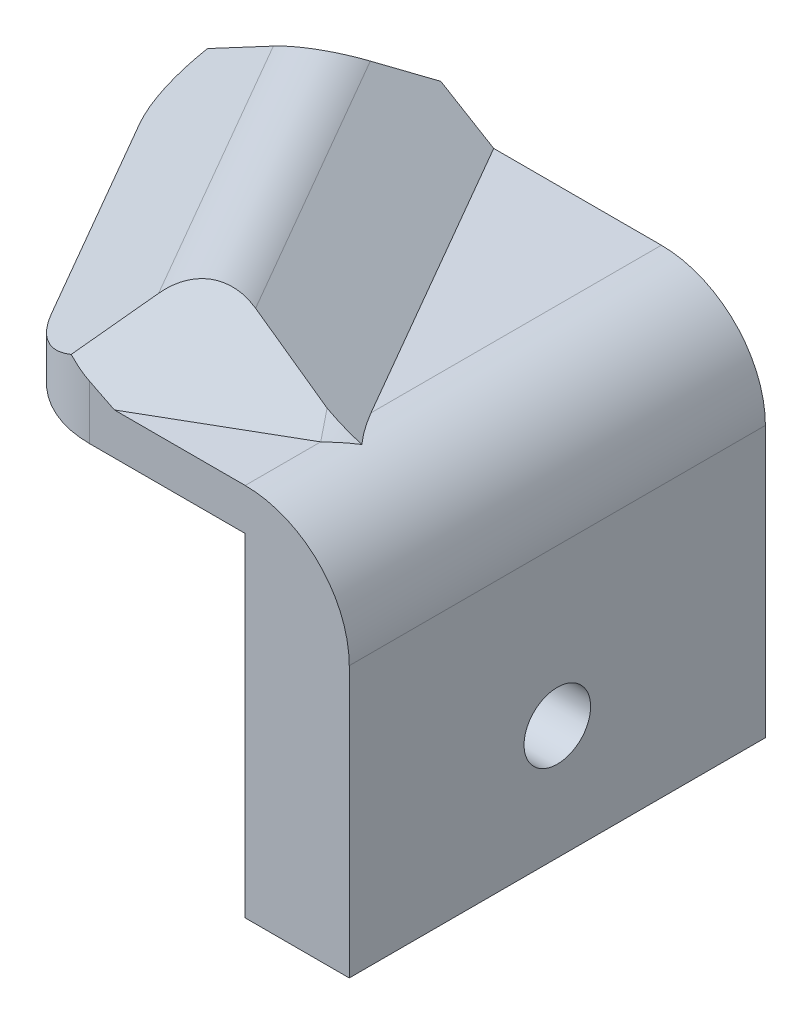
ISO-10303-21;
HEADER;
FILE_DESCRIPTION(('STEP AP214'),'2;1');
FILE_NAME('part.step','',(''),(''),'','','');
FILE_SCHEMA(('AUTOMOTIVE_DESIGN { 1 0 10303 214 1 1 1 1 }'));
ENDSEC;
DATA;
#1=APPLICATION_CONTEXT('core data for automotive mechanical design processes');
#2=APPLICATION_PROTOCOL_DEFINITION('international standard','automotive_design',2000,#1);
#3=PRODUCT_CONTEXT('',#1,'mechanical');
#4=PRODUCT('Part','Part','',(#3));
#5=PRODUCT_RELATED_PRODUCT_CATEGORY('part','',(#4));
#6=PRODUCT_DEFINITION_FORMATION('','',#4);
#7=PRODUCT_DEFINITION_CONTEXT('part definition',#1,'design');
#8=PRODUCT_DEFINITION('design','',#6,#7);
#9=PRODUCT_DEFINITION_SHAPE('','',#8);
#10=(LENGTH_UNIT() NAMED_UNIT(*) SI_UNIT(.MILLI.,.METRE.));
#11=(NAMED_UNIT(*) PLANE_ANGLE_UNIT() SI_UNIT($,.RADIAN.));
#12=(NAMED_UNIT(*) SI_UNIT($,.STERADIAN.) SOLID_ANGLE_UNIT());
#13=UNCERTAINTY_MEASURE_WITH_UNIT(LENGTH_MEASURE(1.E-05),#10,'distance_accuracy_value','');
#14=(GEOMETRIC_REPRESENTATION_CONTEXT(3) GLOBAL_UNCERTAINTY_ASSIGNED_CONTEXT((#13)) GLOBAL_UNIT_ASSIGNED_CONTEXT((#10,
#11,#12)) REPRESENTATION_CONTEXT('',''));
#15=CARTESIAN_POINT('',(0.,0.,0.));
#16=DIRECTION('',(0.,0.,1.));
#17=DIRECTION('',(1.,0.,0.));
#18=AXIS2_PLACEMENT_3D('',#15,#16,#17);
#19=CARTESIAN_POINT('',(0.,18.,0.));
#20=DIRECTION('',(0.,1.,0.));
#21=DIRECTION('',(0.,0.,1.));
#22=AXIS2_PLACEMENT_3D('',#19,#20,#21);
#23=PLANE('',#22);
#24=DIRECTION('',(-0.500000000000001,0.,-0.866025403784438));
#25=VECTOR('',#24,1.);
#26=CARTESIAN_POINT('',(54.6961524227068,18.,82.7365149746594));
#27=LINE('',#26,#25);
#28=CARTESIAN_POINT('',(55.4,18.,83.9556147393155));
#29=VERTEX_POINT('',#28);
#30=CARTESIAN_POINT('',(47.3427220735495,18.,70.));
#31=VERTEX_POINT('',#30);
#32=EDGE_CURVE('E443',#29,#31,#27,.T.);
#33=ORIENTED_EDGE('',*,*,#32,.F.);
#34=DIRECTION('',(0.,0.,-1.));
#35=VECTOR('',#34,1.);
#36=CARTESIAN_POINT('',(55.4,18.,70.));
#37=LINE('',#36,#35);
#38=CARTESIAN_POINT('',(55.4,18.,70.));
#39=VERTEX_POINT('',#38);
#40=EDGE_CURVE('E218',#29,#39,#37,.T.);
#41=ORIENTED_EDGE('',*,*,#40,.T.);
#42=DIRECTION('',(-1.,0.,0.));
#43=VECTOR('',#42,1.);
#44=CARTESIAN_POINT('',(33.4863156129984,18.,70.));
#45=LINE('',#44,#43);
#46=EDGE_CURVE('E197',#39,#31,#45,.T.);
#47=ORIENTED_EDGE('',*,*,#46,.T.);
#48=EDGE_LOOP('',(#33,#41,#47));
#49=FACE_BOUND('',#48,.T.);
#50=ADVANCED_FACE('F35',(#49),#23,.T.);
#51=CARTESIAN_POINT('',(42.1465696508428,18.,75.));
#52=DIRECTION('',(0.,1.,0.));
#53=DIRECTION('',(0.,0.,1.));
#54=AXIS2_PLACEMENT_3D('',#51,#52,#53);
#55=CIRCLE('',#54,5.);
#56=CARTESIAN_POINT('',(41.7257104231816,18.,70.0177437329567));
#57=VERTEX_POINT('',#56);
#58=CARTESIAN_POINT('',(38.0422387692497,18.,72.1443970839066));
#59=VERTEX_POINT('',#58);
#60=EDGE_CURVE('E213',#57,#59,#55,.T.);
#61=ORIENTED_EDGE('',*,*,#60,.T.);
#62=DIRECTION('',(0.866025403784438,0.,-0.500000000000001));
#63=VECTOR('',#62,1.);
#64=CARTESIAN_POINT('',(40.7500000000001,18.,70.5810704084317));
#65=LINE('',#64,#63);
#66=EDGE_CURVE('E232',#59,#57,#65,.T.);
#67=ORIENTED_EDGE('',*,*,#66,.T.);
#68=EDGE_LOOP('',(#61,#67));
#69=FACE_BOUND('',#68,.T.);
#70=ADVANCED_FACE('F322',(#69),#23,.T.);
#71=CARTESIAN_POINT('',(55.4,18.,90.));
#72=VERTEX_POINT('',#71);
#73=CARTESIAN_POINT('',(55.4,18.,86.371600270768));
#74=VERTEX_POINT('',#73);
#75=EDGE_CURVE('E227',#72,#74,#37,.T.);
#76=ORIENTED_EDGE('',*,*,#75,.T.);
#77=DIRECTION('',(-0.866025403784438,0.,0.500000000000001));
#78=VECTOR('',#77,1.);
#79=CARTESIAN_POINT('',(46.2341516219862,18.,91.6635052991656));
#80=LINE('',#79,#78);
#81=CARTESIAN_POINT('',(49.1154273188012,18.,90.));
#82=VERTEX_POINT('',#81);
#83=EDGE_CURVE('E465',#74,#82,#80,.T.);
#84=ORIENTED_EDGE('',*,*,#83,.T.);
#85=DIRECTION('',(1.,0.,0.));
#86=VECTOR('',#85,1.);
#87=CARTESIAN_POINT('',(60.4,18.,90.));
#88=LINE('',#87,#86);
#89=EDGE_CURVE('E195',#82,#72,#88,.T.);
#90=ORIENTED_EDGE('',*,*,#89,.T.);
#91=EDGE_LOOP('',(#76,#84,#90));
#92=FACE_BOUND('',#91,.T.);
#93=ADVANCED_FACE('F318',(#92),#23,.T.);
#94=CARTESIAN_POINT('',(60.4,18.,90.));
#95=DIRECTION('',(0.,0.,-1.));
#96=DIRECTION('',(-1.,0.,0.));
#97=AXIS2_PLACEMENT_3D('',#94,#95,#96);
#98=PLANE('',#97);
#99=DIRECTION('',(0.,-1.,0.));
#100=VECTOR('',#99,1.);
#101=CARTESIAN_POINT('',(60.4,18.,90.));
#102=LINE('',#101,#100);
#103=CARTESIAN_POINT('',(60.4,13.,90.));
#104=VERTEX_POINT('',#103);
#105=CARTESIAN_POINT('',(60.4,0.,90.));
#106=VERTEX_POINT('',#105);
#107=EDGE_CURVE('E208',#104,#106,#102,.T.);
#108=ORIENTED_EDGE('',*,*,#107,.F.);
#109=CARTESIAN_POINT('',(55.4,13.,90.));
#110=DIRECTION('',(0.,0.,-1.));
#111=DIRECTION('',(-1.,0.,0.));
#112=AXIS2_PLACEMENT_3D('',#109,#110,#111);
#113=CIRCLE('',#112,5.);
#114=EDGE_CURVE('E242',#104,#72,#113,.F.);
#115=ORIENTED_EDGE('',*,*,#114,.T.);
#116=ORIENTED_EDGE('',*,*,#89,.F.);
#117=DIRECTION('',(0.894427190999914,-0.447213595499962,0.));
#118=VECTOR('',#117,1.);
#119=CARTESIAN_POINT('',(58.1430854637602,13.4861709275204,90.));
#120=LINE('',#119,#118);
#121=CARTESIAN_POINT('',(47.9200723427391,18.597677488031,90.));
#122=VERTEX_POINT('',#121);
#123=EDGE_CURVE('E365',#82,#122,#120,.F.);
#124=ORIENTED_EDGE('',*,*,#123,.T.);
#125=DIRECTION('',(0.,-1.,0.));
#126=VECTOR('',#125,1.);
#127=CARTESIAN_POINT('',(47.9200723427391,18.,90.));
#128=LINE('',#127,#126);
#129=CARTESIAN_POINT('',(47.9200723427391,16.,89.9999999999999));
#130=VERTEX_POINT('',#129);
#131=EDGE_CURVE('E245',#122,#130,#128,.T.);
#132=ORIENTED_EDGE('',*,*,#131,.T.);
#133=DIRECTION('',(-1.,0.,0.));
#134=VECTOR('',#133,1.);
#135=CARTESIAN_POINT('',(33.4863156129984,16.,89.9999999999999));
#136=LINE('',#135,#134);
#137=CARTESIAN_POINT('',(55.3999999999999,16.,89.9999999999999));
#138=VERTEX_POINT('',#137);
#139=EDGE_CURVE('E185',#138,#130,#136,.T.);
#140=ORIENTED_EDGE('',*,*,#139,.F.);
#141=DIRECTION('',(0.,1.,0.));
#142=VECTOR('',#141,1.);
#143=CARTESIAN_POINT('',(55.3999999999999,0.,89.9999999999999));
#144=LINE('',#143,#142);
#145=CARTESIAN_POINT('',(55.3999999999999,0.,89.9999999999999));
#146=VERTEX_POINT('',#145);
#147=EDGE_CURVE('E166',#146,#138,#144,.T.);
#148=ORIENTED_EDGE('',*,*,#147,.F.);
#149=DIRECTION('',(1.,0.,0.));
#150=VECTOR('',#149,1.);
#151=CARTESIAN_POINT('',(60.4,0.,90.));
#152=LINE('',#151,#150);
#153=EDGE_CURVE('E170',#146,#106,#152,.T.);
#154=ORIENTED_EDGE('',*,*,#153,.T.);
#155=EDGE_LOOP('',(#108,#115,#116,#124,#132,#140,#148,#154));
#156=FACE_BOUND('',#155,.T.);
#157=ADVANCED_FACE('F321',(#156),#98,.F.);
#158=CARTESIAN_POINT('',(60.4,18.,70.));
#159=DIRECTION('',(-1.,0.,0.));
#160=DIRECTION('',(0.,0.,1.));
#161=AXIS2_PLACEMENT_3D('',#158,#159,#160);
#162=PLANE('',#161);
#163=CARTESIAN_POINT('',(60.4,5.5,80.));
#164=DIRECTION('',(1.,0.,0.));
#165=DIRECTION('',(0.,0.,-1.));
#166=AXIS2_PLACEMENT_3D('',#163,#164,#165);
#167=CIRCLE('',#166,1.60000000000001);
#168=CARTESIAN_POINT('',(60.4,5.5,78.4));
#169=VERTEX_POINT('',#168);
#170=EDGE_CURVE('E189',#169,#169,#167,.T.);
#171=ORIENTED_EDGE('',*,*,#170,.F.);
#172=EDGE_LOOP('',(#171));
#173=FACE_BOUND('',#172,.T.);
#174=DIRECTION('',(0.,-1.,0.));
#175=VECTOR('',#174,1.);
#176=CARTESIAN_POINT('',(60.4,18.,70.));
#177=LINE('',#176,#175);
#178=CARTESIAN_POINT('',(60.4,13.,70.));
#179=VERTEX_POINT('',#178);
#180=CARTESIAN_POINT('',(60.4,0.,70.));
#181=VERTEX_POINT('',#180);
#182=EDGE_CURVE('E200',#179,#181,#177,.T.);
#183=ORIENTED_EDGE('',*,*,#182,.F.);
#184=DIRECTION('',(0.,0.,-1.));
#185=VECTOR('',#184,1.);
#186=CARTESIAN_POINT('',(60.4,13.,90.));
#187=LINE('',#186,#185);
#188=EDGE_CURVE('E248',#179,#104,#187,.F.);
#189=ORIENTED_EDGE('',*,*,#188,.T.);
#190=ORIENTED_EDGE('',*,*,#107,.T.);
#191=DIRECTION('',(0.,0.,-1.));
#192=VECTOR('',#191,1.);
#193=CARTESIAN_POINT('',(60.4,0.,70.));
#194=LINE('',#193,#192);
#195=EDGE_CURVE('E203',#106,#181,#194,.T.);
#196=ORIENTED_EDGE('',*,*,#195,.T.);
#197=EDGE_LOOP('',(#183,#189,#190,#196));
#198=FACE_BOUND('',#197,.T.);
#199=ADVANCED_FACE('F333',(#173,#198),#162,.F.);
#200=CARTESIAN_POINT('',(33.4863156129984,18.,70.));
#201=DIRECTION('',(0.,0.,1.));
#202=DIRECTION('',(1.,0.,0.));
#203=AXIS2_PLACEMENT_3D('',#200,#201,#202);
#204=PLANE('',#203);
#205=ORIENTED_EDGE('',*,*,#46,.F.);
#206=CARTESIAN_POINT('',(55.4,13.,70.));
#207=DIRECTION('',(0.,0.,1.));
#208=DIRECTION('',(1.,0.,0.));
#209=AXIS2_PLACEMENT_3D('',#206,#207,#208);
#210=CIRCLE('',#209,5.);
#211=EDGE_CURVE('E249',#39,#179,#210,.F.);
#212=ORIENTED_EDGE('',*,*,#211,.T.);
#213=ORIENTED_EDGE('',*,*,#182,.T.);
#214=DIRECTION('',(-1.,0.,0.));
#215=VECTOR('',#214,1.);
#216=CARTESIAN_POINT('',(33.4863156129984,0.,70.));
#217=LINE('',#216,#215);
#218=CARTESIAN_POINT('',(55.3999999999999,0.,70.));
#219=VERTEX_POINT('',#218);
#220=EDGE_CURVE('E184',#181,#219,#217,.T.);
#221=ORIENTED_EDGE('',*,*,#220,.T.);
#222=DIRECTION('',(0.,1.,0.));
#223=VECTOR('',#222,1.);
#224=CARTESIAN_POINT('',(55.3999999999999,0.,70.));
#225=LINE('',#224,#223);
#226=CARTESIAN_POINT('',(55.3999999999999,16.,70.));
#227=VERTEX_POINT('',#226);
#228=EDGE_CURVE('E163',#219,#227,#225,.T.);
#229=ORIENTED_EDGE('',*,*,#228,.T.);
#230=DIRECTION('',(-1.,0.,0.));
#231=VECTOR('',#230,1.);
#232=CARTESIAN_POINT('',(33.4863156129984,16.,70.));
#233=LINE('',#232,#231);
#234=CARTESIAN_POINT('',(42.1465696508428,16.,70.));
#235=VERTEX_POINT('',#234);
#236=EDGE_CURVE('E174',#227,#235,#233,.T.);
#237=ORIENTED_EDGE('',*,*,#236,.T.);
#238=DIRECTION('',(0.,-1.,0.));
#239=VECTOR('',#238,1.);
#240=CARTESIAN_POINT('',(42.1465696508428,18.,70.));
#241=LINE('',#240,#239);
#242=CARTESIAN_POINT('',(42.1465696508428,18.1950630903322,70.));
#243=VERTEX_POINT('',#242);
#244=EDGE_CURVE('E221',#235,#243,#241,.F.);
#245=ORIENTED_EDGE('',*,*,#244,.T.);
#246=DIRECTION('',(0.894427190999917,0.447213595499956,0.));
#247=VECTOR('',#246,1.);
#248=CARTESIAN_POINT('',(35.1403411844344,14.691948857128,70.));
#249=LINE('',#248,#247);
#250=CARTESIAN_POINT('',(44.8001171434022,19.5218368366118,70.));
#251=VERTEX_POINT('',#250);
#252=EDGE_CURVE('E53',#243,#251,#249,.T.);
#253=ORIENTED_EDGE('',*,*,#252,.T.);
#254=DIRECTION('',(0.858047182766194,-0.513570863802647,0.));
#255=VECTOR('',#254,1.);
#256=CARTESIAN_POINT('',(37.1410125444429,24.1060753771562,70.));
#257=LINE('',#256,#255);
#258=EDGE_CURVE('E11',#31,#251,#257,.F.);
#259=ORIENTED_EDGE('',*,*,#258,.F.);
#260=EDGE_LOOP('',(#205,#212,#213,#221,#229,#237,#245,#253,#259));
#261=FACE_BOUND('',#260,.T.);
#262=ADVANCED_FACE('F182',(#261),#204,.F.);
#263=CARTESIAN_POINT('',(45.033320996791,18.,90.));
#264=DIRECTION('',(0.866025403784438,0.,-0.500000000000002));
#265=DIRECTION('',(-0.500000000000002,0.,-0.866025403784438));
#266=AXIS2_PLACEMENT_3D('',#263,#264,#265);
#267=PLANE('',#266);
#268=DIRECTION('',(0.500000000000002,0.,0.866025403784438));
#269=VECTOR('',#268,1.);
#270=CARTESIAN_POINT('',(45.033320996791,16.,90.));
#271=LINE('',#270,#269);
#272=CARTESIAN_POINT('',(37.8164426319206,16.,77.5));
#273=VERTEX_POINT('',#272);
#274=CARTESIAN_POINT('',(43.5899453238169,16.,87.5));
#275=VERTEX_POINT('',#274);
#276=EDGE_CURVE('E210',#273,#275,#271,.T.);
#277=ORIENTED_EDGE('',*,*,#276,.T.);
#278=DIRECTION('',(0.,-1.,0.));
#279=VECTOR('',#278,1.);
#280=CARTESIAN_POINT('',(43.5899453238169,18.,87.5));
#281=LINE('',#280,#279);
#282=CARTESIAN_POINT('',(43.5899453238169,18.,87.5));
#283=VERTEX_POINT('',#282);
#284=EDGE_CURVE('E234',#275,#283,#281,.F.);
#285=ORIENTED_EDGE('',*,*,#284,.T.);
#286=DIRECTION('',(-0.500000000000001,0.,-0.866025403784438));
#287=VECTOR('',#286,1.);
#288=CARTESIAN_POINT('',(44.3038475772935,18.,88.7365149746594));
#289=LINE('',#288,#287);
#290=CARTESIAN_POINT('',(37.8164426319207,18.,77.5));
#291=VERTEX_POINT('',#290);
#292=EDGE_CURVE('E445',#283,#291,#289,.T.);
#293=ORIENTED_EDGE('',*,*,#292,.T.);
#294=DIRECTION('',(0.,-1.,0.));
#295=VECTOR('',#294,1.);
#296=CARTESIAN_POINT('',(37.8164426319206,18.,77.5));
#297=LINE('',#296,#295);
#298=EDGE_CURVE('E236',#291,#273,#297,.T.);
#299=ORIENTED_EDGE('',*,*,#298,.T.);
#300=EDGE_LOOP('',(#277,#285,#293,#299));
#301=FACE_BOUND('',#300,.T.);
#302=ADVANCED_FACE('F326',(#301),#267,.F.);
#303=CARTESIAN_POINT('',(0.,0.,0.));
#304=DIRECTION('',(0.,1.,0.));
#305=DIRECTION('',(0.,0.,1.));
#306=AXIS2_PLACEMENT_3D('',#303,#304,#305);
#307=PLANE('',#306);
#308=ORIENTED_EDGE('',*,*,#153,.F.);
#309=DIRECTION('',(0.,0.,1.));
#310=VECTOR('',#309,1.);
#311=CARTESIAN_POINT('',(55.3999999999999,0.,70.));
#312=LINE('',#311,#310);
#313=EDGE_CURVE('E171',#219,#146,#312,.T.);
#314=ORIENTED_EDGE('',*,*,#313,.F.);
#315=ORIENTED_EDGE('',*,*,#220,.F.);
#316=ORIENTED_EDGE('',*,*,#195,.F.);
#317=EDGE_LOOP('',(#308,#314,#315,#316));
#318=FACE_BOUND('',#317,.T.);
#319=ADVANCED_FACE('F314',(#318),#307,.F.);
#320=CARTESIAN_POINT('',(33.4863156129984,16.,70.));
#321=DIRECTION('',(0.,1.,0.));
#322=DIRECTION('',(0.,0.,1.));
#323=AXIS2_PLACEMENT_3D('',#320,#321,#322);
#324=PLANE('',#323);
#325=ORIENTED_EDGE('',*,*,#139,.T.);
#326=CARTESIAN_POINT('',(47.9200723427391,16.,85.));
#327=DIRECTION('',(0.,1.,0.));
#328=DIRECTION('',(0.,0.,1.));
#329=AXIS2_PLACEMENT_3D('',#326,#327,#328);
#330=CIRCLE('',#329,5.);
#331=EDGE_CURVE('E239',#130,#275,#330,.F.);
#332=ORIENTED_EDGE('',*,*,#331,.T.);
#333=ORIENTED_EDGE('',*,*,#276,.F.);
#334=CARTESIAN_POINT('',(42.1465696508428,16.,75.));
#335=DIRECTION('',(0.,1.,0.));
#336=DIRECTION('',(0.,0.,1.));
#337=AXIS2_PLACEMENT_3D('',#334,#335,#336);
#338=CIRCLE('',#337,5.);
#339=EDGE_CURVE('E177',#273,#235,#338,.F.);
#340=ORIENTED_EDGE('',*,*,#339,.T.);
#341=ORIENTED_EDGE('',*,*,#236,.F.);
#342=DIRECTION('',(0.,0.,1.));
#343=VECTOR('',#342,1.);
#344=CARTESIAN_POINT('',(55.3999999999999,16.,70.));
#345=LINE('',#344,#343);
#346=EDGE_CURVE('E159',#227,#138,#345,.T.);
#347=ORIENTED_EDGE('',*,*,#346,.T.);
#348=EDGE_LOOP('',(#325,#332,#333,#340,#341,#347));
#349=FACE_BOUND('',#348,.T.);
#350=ADVANCED_FACE('F175',(#349),#324,.F.);
#351=CARTESIAN_POINT('',(55.3999999999999,0.,70.));
#352=DIRECTION('',(1.,0.,0.));
#353=DIRECTION('',(0.,0.,-1.));
#354=AXIS2_PLACEMENT_3D('',#351,#352,#353);
#355=PLANE('',#354);
#356=CARTESIAN_POINT('',(55.3999999999999,5.5,80.));
#357=DIRECTION('',(1.,0.,0.));
#358=DIRECTION('',(0.,0.,-1.));
#359=AXIS2_PLACEMENT_3D('',#356,#357,#358);
#360=CIRCLE('',#359,1.60000000000001);
#361=CARTESIAN_POINT('',(55.3999999999999,5.5,78.4));
#362=VERTEX_POINT('',#361);
#363=EDGE_CURVE('E192',#362,#362,#360,.T.);
#364=ORIENTED_EDGE('',*,*,#363,.T.);
#365=EDGE_LOOP('',(#364));
#366=FACE_BOUND('',#365,.T.);
#367=ORIENTED_EDGE('',*,*,#147,.T.);
#368=ORIENTED_EDGE('',*,*,#346,.F.);
#369=ORIENTED_EDGE('',*,*,#228,.F.);
#370=ORIENTED_EDGE('',*,*,#313,.T.);
#371=EDGE_LOOP('',(#367,#368,#369,#370));
#372=FACE_BOUND('',#371,.T.);
#373=ADVANCED_FACE('F161',(#366,#372),#355,.F.);
#374=CARTESIAN_POINT('',(33.4863156129984,5.5,80.));
#375=DIRECTION('',(1.,0.,0.));
#376=DIRECTION('',(0.,0.,-1.));
#377=AXIS2_PLACEMENT_3D('',#374,#375,#376);
#378=CYLINDRICAL_SURFACE('',#377,1.60000000000001);
#379=CARTESIAN_POINT('',(60.4,5.5,78.4));
#380=CARTESIAN_POINT('',(60.3479166666667,5.5,78.4));
#381=CARTESIAN_POINT('',(60.2958333333333,5.5,78.4));
#382=CARTESIAN_POINT('',(60.1916666666666,5.5,78.4));
#383=CARTESIAN_POINT('',(60.1395833333333,5.5,78.4));
#384=CARTESIAN_POINT('',(60.0354166666667,5.5,78.4));
#385=CARTESIAN_POINT('',(59.9833333333333,5.5,78.4));
#386=CARTESIAN_POINT('',(59.8791666666666,5.5,78.4));
#387=CARTESIAN_POINT('',(59.8270833333333,5.5,78.4));
#388=CARTESIAN_POINT('',(59.7229166666666,5.5,78.4));
#389=CARTESIAN_POINT('',(59.6708333333333,5.5,78.4));
#390=CARTESIAN_POINT('',(59.5666666666666,5.5,78.4));
#391=CARTESIAN_POINT('',(59.5145833333333,5.5,78.4));
#392=CARTESIAN_POINT('',(59.4104166666666,5.5,78.4));
#393=CARTESIAN_POINT('',(59.3583333333333,5.5,78.4));
#394=CARTESIAN_POINT('',(59.2541666666666,5.5,78.4));
#395=CARTESIAN_POINT('',(59.2020833333333,5.5,78.4));
#396=CARTESIAN_POINT('',(59.0979166666666,5.5,78.4));
#397=CARTESIAN_POINT('',(59.0458333333333,5.5,78.4));
#398=CARTESIAN_POINT('',(58.9416666666666,5.5,78.4));
#399=CARTESIAN_POINT('',(58.8895833333333,5.5,78.4));
#400=CARTESIAN_POINT('',(58.7854166666666,5.5,78.4));
#401=CARTESIAN_POINT('',(58.7333333333333,5.5,78.4));
#402=CARTESIAN_POINT('',(58.6291666666666,5.5,78.4));
#403=CARTESIAN_POINT('',(58.5770833333333,5.5,78.4));
#404=CARTESIAN_POINT('',(58.4729166666666,5.5,78.4));
#405=CARTESIAN_POINT('',(58.4208333333333,5.5,78.4));
#406=CARTESIAN_POINT('',(58.3166666666666,5.5,78.4));
#407=CARTESIAN_POINT('',(58.2645833333333,5.5,78.4));
#408=CARTESIAN_POINT('',(58.1604166666666,5.5,78.4));
#409=CARTESIAN_POINT('',(58.1083333333333,5.5,78.4));
#410=CARTESIAN_POINT('',(58.0041666666666,5.5,78.4));
#411=CARTESIAN_POINT('',(57.9520833333333,5.5,78.4));
#412=CARTESIAN_POINT('',(57.8479166666666,5.5,78.4));
#413=CARTESIAN_POINT('',(57.7958333333333,5.5,78.4));
#414=CARTESIAN_POINT('',(57.6916666666666,5.5,78.4));
#415=CARTESIAN_POINT('',(57.6395833333333,5.5,78.4));
#416=CARTESIAN_POINT('',(57.5354166666666,5.5,78.4));
#417=CARTESIAN_POINT('',(57.4833333333333,5.5,78.4));
#418=CARTESIAN_POINT('',(57.3791666666666,5.5,78.4));
#419=CARTESIAN_POINT('',(57.3270833333333,5.5,78.4));
#420=CARTESIAN_POINT('',(57.2229166666666,5.5,78.4));
#421=CARTESIAN_POINT('',(57.1708333333333,5.5,78.4));
#422=CARTESIAN_POINT('',(57.0666666666666,5.5,78.4));
#423=CARTESIAN_POINT('',(57.0145833333333,5.5,78.4));
#424=CARTESIAN_POINT('',(56.9104166666666,5.5,78.4));
#425=CARTESIAN_POINT('',(56.8583333333333,5.5,78.4));
#426=CARTESIAN_POINT('',(56.7541666666666,5.5,78.4));
#427=CARTESIAN_POINT('',(56.7020833333333,5.5,78.4));
#428=CARTESIAN_POINT('',(56.5979166666666,5.5,78.4));
#429=CARTESIAN_POINT('',(56.5458333333333,5.5,78.4));
#430=CARTESIAN_POINT('',(56.4416666666666,5.5,78.4));
#431=CARTESIAN_POINT('',(56.3895833333333,5.5,78.4));
#432=CARTESIAN_POINT('',(56.2854166666666,5.5,78.4));
#433=CARTESIAN_POINT('',(56.2333333333333,5.5,78.4));
#434=CARTESIAN_POINT('',(56.1291666666666,5.5,78.4));
#435=CARTESIAN_POINT('',(56.0770833333333,5.5,78.4));
#436=CARTESIAN_POINT('',(55.9729166666666,5.5,78.4));
#437=CARTESIAN_POINT('',(55.9208333333333,5.5,78.4));
#438=CARTESIAN_POINT('',(55.8166666666666,5.5,78.4));
#439=CARTESIAN_POINT('',(55.7645833333333,5.5,78.4));
#440=CARTESIAN_POINT('',(55.6604166666666,5.5,78.4));
#441=CARTESIAN_POINT('',(55.6083333333333,5.5,78.4));
#442=CARTESIAN_POINT('',(55.5041666666666,5.5,78.4));
#443=CARTESIAN_POINT('',(55.4520833333333,5.5,78.4));
#444=CARTESIAN_POINT('',(55.3999999999999,5.5,78.4));
#445=B_SPLINE_CURVE_WITH_KNOTS('',3,(#379,#380,#381,#382,#383,#384,#385,#386,#387,#388,#389,
#390,#391,#392,#393,#394,#395,#396,#397,#398,#399,#400,#401,#402,#403,#404,#405,#406,#407,#408,
#409,#410,#411,#412,#413,#414,#415,#416,#417,#418,#419,#420,#421,#422,#423,#424,#425,#426,#427,
#428,#429,#430,#431,#432,#433,#434,#435,#436,#437,#438,#439,#440,#441,#442,#443,#444),
.UNSPECIFIED.,.F.,.F.,(4,2,2,2,2,2,2,2,2,2,2,2,2,2,2,2,2,2,2,2,2,2,2,2,2,2,2,2,2,2,2,2,4),(0.,
0.156250000000011,0.312500000000007,0.468750000000011,0.625000000000014,0.781250000000011,
0.937500000000015,1.09375000000002,1.25000000000002,1.40625000000003,1.56250000000002,
1.71875000000003,1.87500000000003,2.03125000000003,2.18750000000004,2.34375000000003,
2.50000000000004,2.65625000000004,2.81250000000004,2.96875000000005,3.12500000000004,
3.28125000000005,3.43750000000005,3.59375000000005,3.75000000000006,3.90625000000006,
4.06250000000005,4.21875000000006,4.37500000000006,4.53125000000006,4.68750000000007,
4.84375000000006,5.00000000000007),.UNSPECIFIED.);
#446=EDGE_CURVE('BSEAM307',#169,#362,#445,.T.);
#447=ORIENTED_EDGE('',*,*,#170,.T.);
#448=ORIENTED_EDGE('',*,*,#363,.F.);
#449=ORIENTED_EDGE('',*,*,#446,.T.);
#450=ORIENTED_EDGE('',*,*,#446,.F.);
#451=EDGE_LOOP('',(#447,#449,#448,#450));
#452=FACE_BOUND('',#451,.T.);
#453=ADVANCED_FACE('F307',(#452),#378,.F.);
#454=CARTESIAN_POINT('',(49.5000000000001,18.5,85.7365149746594));
#455=DIRECTION('',(-0.500000000000001,0.,-0.866025403784438));
#456=DIRECTION('',(-0.866025403784438,0.,0.500000000000001));
#457=AXIS2_PLACEMENT_3D('',#454,#455,#456);
#458=CYLINDRICAL_SURFACE('',#457,3.);
#459=CARTESIAN_POINT('',(41.0000000000001,18.5,71.0140831103239));
#460=DIRECTION('',(0.353553390593273,-0.707106781186551,0.612372435695791));
#461=DIRECTION('',(-0.353553390593276,-0.707106781186544,-0.612372435695797));
#462=AXIS2_PLACEMENT_3D('',#459,#460,#461);
#463=ELLIPSE('',#462,4.24264068711931,3.);
#464=CARTESIAN_POINT('',(43.7111152852268,20.9679381677295,72.2985495015581));
#465=VERTEX_POINT('',#464);
#466=CARTESIAN_POINT('',(42.5000000000001,21.5,73.6121593216772));
#467=VERTEX_POINT('',#466);
#468=EDGE_CURVE('E267',#465,#467,#463,.T.);
#469=ORIENTED_EDGE('',*,*,#468,.T.);
#470=CARTESIAN_POINT('',(41.0000000000001,18.5,71.0140831103239));
#471=DIRECTION('',(0.353553390593273,-0.707106781186551,0.612372435695791));
#472=DIRECTION('',(-0.353553390593276,-0.707106781186544,-0.612372435695797));
#473=AXIS2_PLACEMENT_3D('',#470,#471,#472);
#474=ELLIPSE('',#473,4.24264068711931,3.);
#475=CARTESIAN_POINT('',(40.756822882503,20.9679381677295,74.0042110155356));
#476=VERTEX_POINT('',#475);
#477=EDGE_CURVE('E272',#467,#476,#474,.T.);
#478=ORIENTED_EDGE('',*,*,#477,.T.);
#479=DIRECTION('',(-0.500000000000001,0.,-0.866025403784438));
#480=VECTOR('',#479,1.);
#481=CARTESIAN_POINT('',(48.0228537986382,20.9679381677295,86.5893457316481));
#482=LINE('',#481,#480);
#483=CARTESIAN_POINT('',(48.2888847147735,20.9679381677295,87.0501247947785));
#484=VERTEX_POINT('',#483);
#485=EDGE_CURVE('E376',#484,#476,#482,.T.);
#486=ORIENTED_EDGE('',*,*,#485,.F.);
#487=CARTESIAN_POINT('',(51.0000000000002,18.5,88.3345911860127));
#488=DIRECTION('',(0.353553390593276,0.707106781186545,0.612372435695797));
#489=DIRECTION('',(-0.353553390593273,0.707106781186551,-0.612372435695791));
#490=AXIS2_PLACEMENT_3D('',#487,#488,#489);
#491=ELLIPSE('',#490,4.24264068711927,3.);
#492=CARTESIAN_POINT('',(49.5000000000002,21.5,85.7365149746594));
#493=VERTEX_POINT('',#492);
#494=EDGE_CURVE('E259',#484,#493,#491,.F.);
#495=ORIENTED_EDGE('',*,*,#494,.T.);
#496=CARTESIAN_POINT('',(51.0000000000002,18.5,88.3345911860127));
#497=DIRECTION('',(0.353553390593276,0.707106781186545,0.612372435695797));
#498=DIRECTION('',(-0.353553390593273,0.707106781186551,-0.612372435695791));
#499=AXIS2_PLACEMENT_3D('',#496,#497,#498);
#500=ELLIPSE('',#499,4.24264068711927,3.);
#501=CARTESIAN_POINT('',(51.2431771174973,20.9679381677295,85.344463280801));
#502=VERTEX_POINT('',#501);
#503=EDGE_CURVE('E359',#493,#502,#500,.F.);
#504=ORIENTED_EDGE('',*,*,#503,.T.);
#505=DIRECTION('',(-0.500000000000001,0.,-0.866025403784438));
#506=VECTOR('',#505,1.);
#507=CARTESIAN_POINT('',(50.977146201362,20.9679381677295,84.8836842176706));
#508=LINE('',#507,#506);
#509=EDGE_CURVE('E385',#502,#465,#508,.T.);
#510=ORIENTED_EDGE('',*,*,#509,.T.);
#511=EDGE_LOOP('',(#469,#478,#486,#495,#504,#510));
#512=FACE_BOUND('',#511,.T.);
#513=ADVANCED_FACE('F303',(#512),#458,.T.);
#514=CARTESIAN_POINT('',(44.3038475772935,18.,88.7365149746594));
#515=DIRECTION('',(0.492382067120635,-0.822646055909838,-0.284276918996244));
#516=DIRECTION('',(0.858047182766194,0.513570863802647,0.));
#517=AXIS2_PLACEMENT_3D('',#514,#515,#516);
#518=PLANE('',#517);
#519=ORIENTED_EDGE('',*,*,#292,.F.);
#520=CARTESIAN_POINT('',(47.9200723427391,21.4556406969196,85.));
#521=DIRECTION('',(0.492382067120635,-0.822646055909838,-0.284276918996244));
#522=DIRECTION('',(-0.712432382740993,-0.568553837992487,0.41132302795492));
#523=AXIS2_PLACEMENT_3D('',#520,#521,#522);
#524=ELLIPSE('',#523,6.07794806050586,5.);
#525=CARTESIAN_POINT('',(46.9374911507002,19.1734030921471,89.9025028506928));
#526=VERTEX_POINT('',#525);
#527=EDGE_CURVE('E230',#283,#526,#524,.F.);
#528=ORIENTED_EDGE('',*,*,#527,.T.);
#529=DIRECTION('',(-0.372203086546608,-0.494253866382706,0.785606757819028));
#530=VECTOR('',#529,1.);
#531=CARTESIAN_POINT('',(46.6977174284119,18.8550040955199,90.4085917666254));
#532=LINE('',#531,#530);
#533=EDGE_CURVE('E371',#526,#484,#532,.F.);
#534=ORIENTED_EDGE('',*,*,#533,.T.);
#535=ORIENTED_EDGE('',*,*,#485,.T.);
#536=DIRECTION('',(-0.866456952929312,-0.494253866382704,-0.0704660505931775));
#537=VECTOR('',#536,1.);
#538=CARTESIAN_POINT('',(43.0482173104846,22.2750204775995,74.1905624726336));
#539=LINE('',#538,#537);
#540=CARTESIAN_POINT('',(37.312111290046,19.0029680472992,73.7240641247612));
#541=VERTEX_POINT('',#540);
#542=EDGE_CURVE('E275',#476,#541,#539,.T.);
#543=ORIENTED_EDGE('',*,*,#542,.T.);
#544=CARTESIAN_POINT('',(42.1465696508428,21.4556406969196,75.));
#545=DIRECTION('',(0.492382067120635,-0.822646055909838,-0.284276918996244));
#546=DIRECTION('',(-0.712432382740993,-0.568553837992487,0.41132302795492));
#547=AXIS2_PLACEMENT_3D('',#544,#545,#546);
#548=ELLIPSE('',#547,6.07794806050586,5.);
#549=EDGE_CURVE('E60',#541,#291,#548,.F.);
#550=ORIENTED_EDGE('',*,*,#549,.T.);
#551=EDGE_LOOP('',(#519,#528,#534,#535,#543,#550));
#552=FACE_BOUND('',#551,.T.);
#553=ADVANCED_FACE('F300',(#552),#518,.F.);
#554=CARTESIAN_POINT('',(54.6961524227068,18.,82.7365149746594));
#555=DIRECTION('',(-0.492382067120635,-0.822646055909838,0.284276918996244));
#556=DIRECTION('',(0.858047182766194,-0.513570863802647,0.));
#557=AXIS2_PLACEMENT_3D('',#554,#555,#556);
#558=PLANE('',#557);
#559=ORIENTED_EDGE('',*,*,#32,.T.);
#560=ORIENTED_EDGE('',*,*,#258,.T.);
#561=DIRECTION('',(-0.372203086546602,0.494253866382704,0.785606757819032));
#562=VECTOR('',#561,1.);
#563=CARTESIAN_POINT('',(42.7268031671151,22.2750204775995,74.3761310148294));
#564=LINE('',#563,#562);
#565=EDGE_CURVE('E265',#251,#465,#564,.T.);
#566=ORIENTED_EDGE('',*,*,#565,.T.);
#567=ORIENTED_EDGE('',*,*,#509,.F.);
#568=DIRECTION('',(-0.866456952929311,0.494253866382706,-0.0704660505931704));
#569=VECTOR('',#568,1.);
#570=CARTESIAN_POINT('',(54.9472784760686,18.8550040955199,85.6457054750645));
#571=LINE('',#570,#569);
#572=CARTESIAN_POINT('',(54.9825611037172,18.8348777925656,85.6485748933507));
#573=VERTEX_POINT('',#572);
#574=EDGE_CURVE('E288',#502,#573,#571,.F.);
#575=ORIENTED_EDGE('',*,*,#574,.T.);
#576=CARTESIAN_POINT('',(56.3975384555021,17.8994845151619,85.3925208078891));
#577=CARTESIAN_POINT('',(56.3441996321149,17.9375998825257,85.4104356997604));
#578=CARTESIAN_POINT('',(56.2904667798865,17.9756150767401,85.4273860595936));
#579=CARTESIAN_POINT('',(56.181563264194,18.0519169207002,85.4595874588749));
#580=CARTESIAN_POINT('',(56.1263829844628,18.090200545274,85.4748131590101));
#581=CARTESIAN_POINT('',(56.0145572182328,18.1670455590252,85.503525472951));
#582=CARTESIAN_POINT('',(55.9579020494644,18.2056031961977,85.516984384056));
#583=CARTESIAN_POINT('',(55.8431015164043,18.2830007415036,85.5421298712298));
#584=CARTESIAN_POINT('',(55.7849465688688,18.3218361173533,85.5537866087455));
#585=CARTESIAN_POINT('',(55.6671238441369,18.3997917664272,85.5752966047017));
#586=CARTESIAN_POINT('',(55.6074467378407,18.4389066879053,85.5851180955874));
#587=CARTESIAN_POINT('',(55.4865594538079,18.5174227324839,85.6029296047665));
#588=CARTESIAN_POINT('',(55.4253403424003,18.5568176706312,85.6108861805434));
#589=CARTESIAN_POINT('',(55.3013517415334,18.6358936021937,85.624942245126));
#590=CARTESIAN_POINT('',(55.2385738463667,18.6755675783921,85.6310068794417));
#591=CARTESIAN_POINT('',(55.1114515780304,18.7552019307092,85.6412568713395));
#592=CARTESIAN_POINT('',(55.0470994086256,18.7951545088004,85.645406255895));
#593=CARTESIAN_POINT('',(54.9825611037172,18.8348777925656,85.6485748933507));
#594=B_SPLINE_CURVE_WITH_KNOTS('',3,(#576,#577,#578,#579,#580,#581,#582,#583,#584,#585,#586,
#587,#588,#589,#590,#591,#592,#593),.UNSPECIFIED.,.F.,.F.,(4,2,2,2,2,2,2,2,4),(0.,
0.20387453340917,0.410435922511565,0.619924543049408,0.832577165544466,1.0486251710752,
1.2682929615349,1.49179658135069,1.71934255845798),.UNSPECIFIED.);
#595=CARTESIAN_POINT('',(56.397538971202,17.8994811971201,85.3925196852249));
#596=VERTEX_POINT('',#595);
#597=EDGE_CURVE('E282',#573,#596,#594,.F.);
#598=ORIENTED_EDGE('',*,*,#597,.T.);
#599=CARTESIAN_POINT('',(55.4,13.,69.4865178668974));
#600=DIRECTION('',(-0.492382067120635,-0.822646055909838,0.284276918996244));
#601=DIRECTION('',(0.145996342848057,0.243923009470181,0.958742214219236));
#602=AXIS2_PLACEMENT_3D('',#599,#600,#601);
#603=ELLIPSE('',#602,17.5884838545969,5.);
#604=EDGE_CURVE('E352',#29,#596,#603,.F.);
#605=ORIENTED_EDGE('',*,*,#604,.F.);
#606=EDGE_LOOP('',(#559,#560,#566,#567,#575,#598,#605));
#607=FACE_BOUND('',#606,.T.);
#608=ADVANCED_FACE('F290',(#607),#558,.F.);
#609=CARTESIAN_POINT('',(55.4,13.,0.));
#610=DIRECTION('',(0.,0.,1.));
#611=DIRECTION('',(1.,0.,0.));
#612=AXIS2_PLACEMENT_3D('',#609,#610,#611);
#613=CYLINDRICAL_SURFACE('',#612,5.);
#614=ORIENTED_EDGE('',*,*,#40,.F.);
#615=ORIENTED_EDGE('',*,*,#604,.T.);
#616=CARTESIAN_POINT('',(55.4,18.,86.371600270768));
#617=CARTESIAN_POINT('',(55.7515000063927,18.0000293273654,86.0266046111394));
#618=CARTESIAN_POINT('',(56.1029868026514,17.9628273276738,85.6816219171971));
#619=CARTESIAN_POINT('',(56.4466925657019,17.889216161401,85.3442762720045));
#620=B_SPLINE_CURVE_WITH_KNOTS('',3,(#616,#617,#618,#619),.UNSPECIFIED.,.F.,.F.,(4,4),
(4.50149054503646,4.71238898038469),.UNSPECIFIED.);
#621=EDGE_CURVE('E360',#596,#74,#620,.F.);
#622=ORIENTED_EDGE('',*,*,#621,.T.);
#623=ORIENTED_EDGE('',*,*,#75,.F.);
#624=ORIENTED_EDGE('',*,*,#114,.F.);
#625=ORIENTED_EDGE('',*,*,#188,.F.);
#626=ORIENTED_EDGE('',*,*,#211,.F.);
#627=EDGE_LOOP('',(#614,#615,#622,#623,#624,#625,#626));
#628=FACE_BOUND('',#627,.T.);
#629=ADVANCED_FACE('F299',(#628),#613,.T.);
#630=CARTESIAN_POINT('',(47.9200723427391,18.,85.));
#631=DIRECTION('',(0.,-1.,0.));
#632=DIRECTION('',(0.,0.,-1.));
#633=AXIS2_PLACEMENT_3D('',#630,#631,#632);
#634=CYLINDRICAL_SURFACE('',#633,5.);
#635=ORIENTED_EDGE('',*,*,#527,.F.);
#636=ORIENTED_EDGE('',*,*,#284,.F.);
#637=ORIENTED_EDGE('',*,*,#331,.F.);
#638=ORIENTED_EDGE('',*,*,#131,.F.);
#639=CARTESIAN_POINT('',(47.9200723427391,22.9278045069533,85.));
#640=DIRECTION('',(0.353553390593276,0.707106781186545,0.612372435695797));
#641=DIRECTION('',(0.353553390593273,-0.707106781186551,0.612372435695791));
#642=AXIS2_PLACEMENT_3D('',#639,#640,#641);
#643=ELLIPSE('',#642,7.0710678118655,5.);
#644=EDGE_CURVE('E368',#122,#526,#643,.F.);
#645=ORIENTED_EDGE('',*,*,#644,.T.);
#646=EDGE_LOOP('',(#635,#636,#637,#638,#645));
#647=FACE_BOUND('',#646,.T.);
#648=ADVANCED_FACE('F343',(#647),#634,.T.);
#649=CARTESIAN_POINT('',(42.1465696508428,18.,75.));
#650=DIRECTION('',(0.,-1.,0.));
#651=DIRECTION('',(0.,0.,-1.));
#652=AXIS2_PLACEMENT_3D('',#649,#650,#651);
#653=CYLINDRICAL_SURFACE('',#652,5.);
#654=ORIENTED_EDGE('',*,*,#60,.F.);
#655=CARTESIAN_POINT('',(42.1465696508428,22.5251901092543,75.));
#656=DIRECTION('',(0.353553390593273,-0.707106781186551,0.612372435695791));
#657=DIRECTION('',(-0.353553390593276,-0.707106781186544,-0.612372435695797));
#658=AXIS2_PLACEMENT_3D('',#655,#656,#657);
#659=ELLIPSE('',#658,7.07106781186544,5.);
#660=EDGE_CURVE('E254',#57,#243,#659,.T.);
#661=ORIENTED_EDGE('',*,*,#660,.T.);
#662=ORIENTED_EDGE('',*,*,#244,.F.);
#663=ORIENTED_EDGE('',*,*,#339,.F.);
#664=ORIENTED_EDGE('',*,*,#298,.F.);
#665=ORIENTED_EDGE('',*,*,#549,.F.);
#666=CARTESIAN_POINT('',(42.1465696508428,22.5251901092543,75.));
#667=DIRECTION('',(0.353553390593273,-0.707106781186551,0.612372435695791));
#668=DIRECTION('',(-0.353553390593276,-0.707106781186544,-0.612372435695797));
#669=AXIS2_PLACEMENT_3D('',#666,#667,#668);
#670=ELLIPSE('',#669,7.07106781186544,5.);
#671=EDGE_CURVE('E45',#541,#59,#670,.T.);
#672=ORIENTED_EDGE('',*,*,#671,.T.);
#673=EDGE_LOOP('',(#654,#661,#662,#663,#664,#665,#672));
#674=FACE_BOUND('',#673,.T.);
#675=ADVANCED_FACE('F255',(#674),#653,.T.);
#676=CARTESIAN_POINT('',(53.65,21.5000000000001,83.3405113575225));
#677=CARTESIAN_POINT('',(54.2475500108675,21.5000498565213,82.9955156978938));
#678=CARTESIAN_POINT('',(54.8450775645074,21.4368064570456,82.6505330039516));
#679=CARTESIAN_POINT('',(55.4293773616932,21.3116674743817,82.313187358759));
#680=CARTESIAN_POINT('',(55.4,18.,86.371600270768));
#681=CARTESIAN_POINT('',(55.7515000063927,18.0000293273654,86.0266046111394));
#682=CARTESIAN_POINT('',(56.1029868026514,17.9628273276738,85.6816219171971));
#683=CARTESIAN_POINT('',(56.4466925657019,17.889216161401,85.3442762720045));
#684=B_SPLINE_SURFACE_WITH_KNOTS('',1,3,((#676,#677,#678,#679),(#680,#681,#682,#683)),
.UNSPECIFIED.,.F.,.F.,.F.,(2,2),(4,4),(0.,1.),(4.50149054503646,4.71238898038469),.UNSPECIFIED.);
#685=CARTESIAN_POINT('',(53.65,21.5000000000001,83.3405113575225));
#686=CARTESIAN_POINT('',(55.4,18.,86.371600270768));
#687=B_SPLINE_CURVE_WITH_KNOTS('',1,(#685,#686),.UNSPECIFIED.,.F.,.F.,(2,2),(0.,1.),.UNSPECIFIED.);
#688=EDGE_CURVE('E383',#74,#573,#687,.F.);
#689=ORIENTED_EDGE('',*,*,#621,.F.);
#690=ORIENTED_EDGE('',*,*,#597,.F.);
#691=ORIENTED_EDGE('',*,*,#688,.F.);
#692=EDGE_LOOP('',(#689,#690,#691));
#693=FACE_BOUND('',#692,.T.);
#694=ADVANCED_FACE('F388',(#693),#684,.T.);
#695=CARTESIAN_POINT('',(49.5000000000001,21.5000000000001,85.7365149746594));
#696=DIRECTION('',(0.353553390593276,0.707106781186545,0.612372435695797));
#697=DIRECTION('',(-0.866025403784438,0.,0.500000000000001));
#698=AXIS2_PLACEMENT_3D('',#695,#696,#697);
#699=PLANE('',#698);
#700=ORIENTED_EDGE('',*,*,#123,.F.);
#701=ORIENTED_EDGE('',*,*,#83,.F.);
#702=ORIENTED_EDGE('',*,*,#688,.T.);
#703=ORIENTED_EDGE('',*,*,#574,.F.);
#704=ORIENTED_EDGE('',*,*,#503,.F.);
#705=ORIENTED_EDGE('',*,*,#494,.F.);
#706=ORIENTED_EDGE('',*,*,#533,.F.);
#707=ORIENTED_EDGE('',*,*,#644,.F.);
#708=EDGE_LOOP('',(#700,#701,#702,#703,#704,#705,#706,#707));
#709=FACE_BOUND('',#708,.T.);
#710=ADVANCED_FACE('F379',(#709),#699,.T.);
#711=CARTESIAN_POINT('',(40.7500000000001,18.,70.5810704084316));
#712=DIRECTION('',(0.353553390593273,-0.707106781186551,0.612372435695791));
#713=DIRECTION('',(0.866025403784438,0.,-0.500000000000001));
#714=AXIS2_PLACEMENT_3D('',#711,#712,#713);
#715=PLANE('',#714);
#716=ORIENTED_EDGE('',*,*,#542,.F.);
#717=ORIENTED_EDGE('',*,*,#477,.F.);
#718=ORIENTED_EDGE('',*,*,#468,.F.);
#719=ORIENTED_EDGE('',*,*,#565,.F.);
#720=ORIENTED_EDGE('',*,*,#252,.F.);
#721=ORIENTED_EDGE('',*,*,#660,.F.);
#722=ORIENTED_EDGE('',*,*,#66,.F.);
#723=ORIENTED_EDGE('',*,*,#671,.F.);
#724=EDGE_LOOP('',(#716,#717,#718,#719,#720,#721,#722,#723));
#725=FACE_BOUND('',#724,.T.);
#726=ADVANCED_FACE('F37',(#725),#715,.F.);
#727=CLOSED_SHELL('',(#50,#70,#93,#157,#199,#262,#302,#319,#350,#373,#453,#513,#553,#608,#629,
#648,#675,#694,#710,#726));
#728=MANIFOLD_SOLID_BREP('B2',#727);
#729=ADVANCED_BREP_SHAPE_REPRESENTATION('',(#18,#728),#14);
#730=SHAPE_DEFINITION_REPRESENTATION(#9,#729);
ENDSEC;
END-ISO-10303-21;
